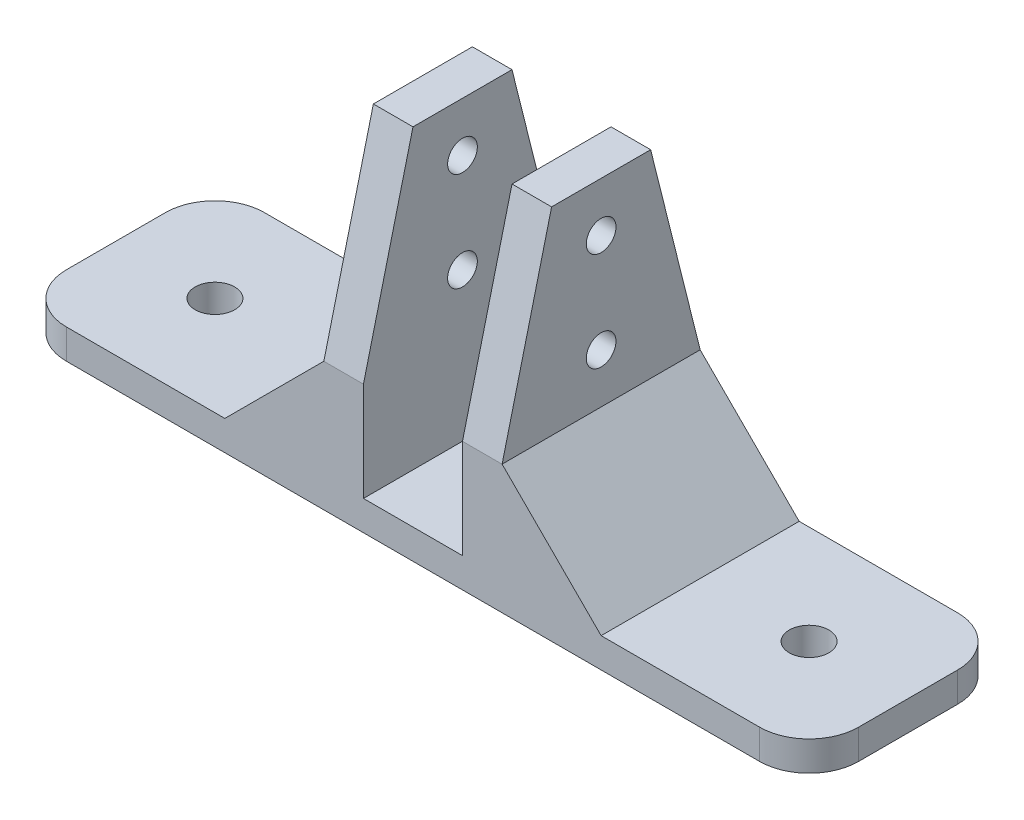
ISO-10303-21;
HEADER;
FILE_DESCRIPTION(('STEP AP214'),'2;1');
FILE_NAME('part.step','',(''),(''),'','','');
FILE_SCHEMA(('AUTOMOTIVE_DESIGN { 1 0 10303 214 1 1 1 1 }'));
ENDSEC;
DATA;
#1=APPLICATION_CONTEXT('core data for automotive mechanical design processes');
#2=APPLICATION_PROTOCOL_DEFINITION('international standard','automotive_design',2000,#1);
#3=PRODUCT_CONTEXT('',#1,'mechanical');
#4=PRODUCT('Part','Part','',(#3));
#5=PRODUCT_RELATED_PRODUCT_CATEGORY('part','',(#4));
#6=PRODUCT_DEFINITION_FORMATION('','',#4);
#7=PRODUCT_DEFINITION_CONTEXT('part definition',#1,'design');
#8=PRODUCT_DEFINITION('design','',#6,#7);
#9=PRODUCT_DEFINITION_SHAPE('','',#8);
#10=(LENGTH_UNIT() NAMED_UNIT(*) SI_UNIT(.MILLI.,.METRE.));
#11=(NAMED_UNIT(*) PLANE_ANGLE_UNIT() SI_UNIT($,.RADIAN.));
#12=(NAMED_UNIT(*) SI_UNIT($,.STERADIAN.) SOLID_ANGLE_UNIT());
#13=UNCERTAINTY_MEASURE_WITH_UNIT(LENGTH_MEASURE(1.E-05),#10,'distance_accuracy_value','');
#14=(GEOMETRIC_REPRESENTATION_CONTEXT(3) GLOBAL_UNCERTAINTY_ASSIGNED_CONTEXT((#13)) GLOBAL_UNIT_ASSIGNED_CONTEXT((#10,
#11,#12)) REPRESENTATION_CONTEXT('',''));
#15=CARTESIAN_POINT('',(0.,0.,0.));
#16=DIRECTION('',(0.,0.,1.));
#17=DIRECTION('',(1.,0.,0.));
#18=AXIS2_PLACEMENT_3D('',#15,#16,#17);
#19=CARTESIAN_POINT('',(0.,3.,0.));
#20=DIRECTION('',(0.,1.,0.));
#21=DIRECTION('',(0.,0.,1.));
#22=AXIS2_PLACEMENT_3D('',#19,#20,#21);
#23=PLANE('',#22);
#24=CARTESIAN_POINT('',(30.,3.,0.));
#25=DIRECTION('',(0.,1.,0.));
#26=DIRECTION('',(0.,0.,1.));
#27=AXIS2_PLACEMENT_3D('',#24,#25,#26);
#28=CIRCLE('',#27,2.);
#29=CARTESIAN_POINT('',(30.,3.,2.));
#30=VERTEX_POINT('',#29);
#31=EDGE_CURVE('E394',#30,#30,#28,.T.);
#32=ORIENTED_EDGE('',*,*,#31,.F.);
#33=EDGE_LOOP('',(#32));
#34=FACE_BOUND('',#33,.T.);
#35=DIRECTION('',(0.,0.,-1.));
#36=VECTOR('',#35,1.);
#37=CARTESIAN_POINT('',(40.,3.,-10.));
#38=LINE('',#37,#36);
#39=CARTESIAN_POINT('',(40.,3.,5.));
#40=VERTEX_POINT('',#39);
#41=CARTESIAN_POINT('',(40.,3.,-5.));
#42=VERTEX_POINT('',#41);
#43=EDGE_CURVE('E282',#40,#42,#38,.T.);
#44=ORIENTED_EDGE('',*,*,#43,.T.);
#45=CARTESIAN_POINT('',(35.,3.,-5.));
#46=DIRECTION('',(0.,1.,0.));
#47=DIRECTION('',(0.,0.,1.));
#48=AXIS2_PLACEMENT_3D('',#45,#46,#47);
#49=CIRCLE('',#48,5.);
#50=CARTESIAN_POINT('',(35.,3.,-10.));
#51=VERTEX_POINT('',#50);
#52=EDGE_CURVE('E257',#42,#51,#49,.T.);
#53=ORIENTED_EDGE('',*,*,#52,.T.);
#54=DIRECTION('',(-1.,0.,0.));
#55=VECTOR('',#54,1.);
#56=CARTESIAN_POINT('',(-40.,3.,-10.));
#57=LINE('',#56,#55);
#58=CARTESIAN_POINT('',(18.9999999999995,3.,-10.));
#59=VERTEX_POINT('',#58);
#60=EDGE_CURVE('E290',#51,#59,#57,.T.);
#61=ORIENTED_EDGE('',*,*,#60,.T.);
#62=DIRECTION('',(0.,0.,1.));
#63=VECTOR('',#62,1.);
#64=CARTESIAN_POINT('',(18.9999999999995,3.,-10.));
#65=LINE('',#64,#63);
#66=CARTESIAN_POINT('',(18.9999999999995,3.,10.));
#67=VERTEX_POINT('',#66);
#68=EDGE_CURVE('E437',#59,#67,#65,.T.);
#69=ORIENTED_EDGE('',*,*,#68,.T.);
#70=DIRECTION('',(1.,0.,0.));
#71=VECTOR('',#70,1.);
#72=CARTESIAN_POINT('',(-40.,3.,10.));
#73=LINE('',#72,#71);
#74=CARTESIAN_POINT('',(35.,3.,10.));
#75=VERTEX_POINT('',#74);
#76=EDGE_CURVE('E236',#67,#75,#73,.T.);
#77=ORIENTED_EDGE('',*,*,#76,.T.);
#78=CARTESIAN_POINT('',(35.,3.,5.));
#79=DIRECTION('',(0.,1.,0.));
#80=DIRECTION('',(0.,0.,1.));
#81=AXIS2_PLACEMENT_3D('',#78,#79,#80);
#82=CIRCLE('',#81,5.);
#83=EDGE_CURVE('E310',#75,#40,#82,.T.);
#84=ORIENTED_EDGE('',*,*,#83,.T.);
#85=EDGE_LOOP('',(#44,#53,#61,#69,#77,#84));
#86=FACE_BOUND('',#85,.T.);
#87=ADVANCED_FACE('F35',(#34,#86),#23,.T.);
#88=CARTESIAN_POINT('',(-5.,3.,10.));
#89=VERTEX_POINT('',#88);
#90=CARTESIAN_POINT('',(5.,3.,10.));
#91=VERTEX_POINT('',#90);
#92=EDGE_CURVE('E240',#89,#91,#73,.T.);
#93=ORIENTED_EDGE('',*,*,#92,.T.);
#94=DIRECTION('',(0.,0.,1.));
#95=VECTOR('',#94,1.);
#96=CARTESIAN_POINT('',(5.,3.,-10.));
#97=LINE('',#96,#95);
#98=CARTESIAN_POINT('',(5.,3.,-10.));
#99=VERTEX_POINT('',#98);
#100=EDGE_CURVE('E439',#99,#91,#97,.T.);
#101=ORIENTED_EDGE('',*,*,#100,.F.);
#102=CARTESIAN_POINT('',(-5.,3.,-10.));
#103=VERTEX_POINT('',#102);
#104=EDGE_CURVE('E242',#99,#103,#57,.T.);
#105=ORIENTED_EDGE('',*,*,#104,.T.);
#106=DIRECTION('',(0.,0.,1.));
#107=VECTOR('',#106,1.);
#108=CARTESIAN_POINT('',(-5.,3.,-10.));
#109=LINE('',#108,#107);
#110=EDGE_CURVE('E200',#103,#89,#109,.T.);
#111=ORIENTED_EDGE('',*,*,#110,.T.);
#112=EDGE_LOOP('',(#93,#101,#105,#111));
#113=FACE_BOUND('',#112,.T.);
#114=ADVANCED_FACE('F366',(#113),#23,.T.);
#115=CARTESIAN_POINT('',(40.,3.,-10.));
#116=DIRECTION('',(-1.,0.,0.));
#117=DIRECTION('',(0.,0.,1.));
#118=AXIS2_PLACEMENT_3D('',#115,#116,#117);
#119=PLANE('',#118);
#120=DIRECTION('',(0.,0.,-1.));
#121=VECTOR('',#120,1.);
#122=CARTESIAN_POINT('',(40.,0.,-10.));
#123=LINE('',#122,#121);
#124=CARTESIAN_POINT('',(40.,0.,5.));
#125=VERTEX_POINT('',#124);
#126=CARTESIAN_POINT('',(40.,0.,-5.));
#127=VERTEX_POINT('',#126);
#128=EDGE_CURVE('E195',#125,#127,#123,.T.);
#129=ORIENTED_EDGE('',*,*,#128,.T.);
#130=DIRECTION('',(0.,-1.,0.));
#131=VECTOR('',#130,1.);
#132=CARTESIAN_POINT('',(40.,3.,-5.));
#133=LINE('',#132,#131);
#134=EDGE_CURVE('E309',#127,#42,#133,.F.);
#135=ORIENTED_EDGE('',*,*,#134,.T.);
#136=ORIENTED_EDGE('',*,*,#43,.F.);
#137=DIRECTION('',(0.,-1.,0.));
#138=VECTOR('',#137,1.);
#139=CARTESIAN_POINT('',(40.,3.,5.));
#140=LINE('',#139,#138);
#141=EDGE_CURVE('E306',#40,#125,#140,.T.);
#142=ORIENTED_EDGE('',*,*,#141,.T.);
#143=EDGE_LOOP('',(#129,#135,#136,#142));
#144=FACE_BOUND('',#143,.T.);
#145=ADVANCED_FACE('F331',(#144),#119,.F.);
#146=CARTESIAN_POINT('',(-40.,3.,-10.));
#147=DIRECTION('',(0.,0.,1.));
#148=DIRECTION('',(1.,0.,0.));
#149=AXIS2_PLACEMENT_3D('',#146,#147,#148);
#150=PLANE('',#149);
#151=ORIENTED_EDGE('',*,*,#60,.F.);
#152=DIRECTION('',(0.,-1.,0.));
#153=VECTOR('',#152,1.);
#154=CARTESIAN_POINT('',(35.,3.,-10.));
#155=LINE('',#154,#153);
#156=CARTESIAN_POINT('',(35.,0.,-10.));
#157=VERTEX_POINT('',#156);
#158=EDGE_CURVE('E297',#51,#157,#155,.T.);
#159=ORIENTED_EDGE('',*,*,#158,.T.);
#160=DIRECTION('',(-1.,0.,0.));
#161=VECTOR('',#160,1.);
#162=CARTESIAN_POINT('',(-40.,0.,-10.));
#163=LINE('',#162,#161);
#164=CARTESIAN_POINT('',(-35.,0.,-10.));
#165=VERTEX_POINT('',#164);
#166=EDGE_CURVE('E198',#157,#165,#163,.T.);
#167=ORIENTED_EDGE('',*,*,#166,.T.);
#168=DIRECTION('',(0.,-1.,0.));
#169=VECTOR('',#168,1.);
#170=CARTESIAN_POINT('',(-35.,3.,-10.));
#171=LINE('',#170,#169);
#172=CARTESIAN_POINT('',(-35.,3.,-10.));
#173=VERTEX_POINT('',#172);
#174=EDGE_CURVE('E295',#165,#173,#171,.F.);
#175=ORIENTED_EDGE('',*,*,#174,.T.);
#176=CARTESIAN_POINT('',(-18.9999999999995,3.,-10.));
#177=VERTEX_POINT('',#176);
#178=EDGE_CURVE('E284',#177,#173,#57,.T.);
#179=ORIENTED_EDGE('',*,*,#178,.F.);
#180=DIRECTION('',(-0.70710678118653,-0.707106781186566,0.));
#181=VECTOR('',#180,1.);
#182=CARTESIAN_POINT('',(-11.0000000000002,10.9999999999997,-10.));
#183=LINE('',#182,#181);
#184=CARTESIAN_POINT('',(-9.,13.,-10.));
#185=VERTEX_POINT('',#184);
#186=EDGE_CURVE('E221',#185,#177,#183,.T.);
#187=ORIENTED_EDGE('',*,*,#186,.F.);
#188=DIRECTION('',(-1.,0.,0.));
#189=VECTOR('',#188,1.);
#190=CARTESIAN_POINT('',(191.,12.9999999999975,-10.));
#191=LINE('',#190,#189);
#192=CARTESIAN_POINT('',(-5.,13.,-10.));
#193=VERTEX_POINT('',#192);
#194=EDGE_CURVE('E177',#193,#185,#191,.T.);
#195=ORIENTED_EDGE('',*,*,#194,.F.);
#196=DIRECTION('',(0.,1.,0.));
#197=VECTOR('',#196,1.);
#198=CARTESIAN_POINT('',(-5.,0.,-10.));
#199=LINE('',#198,#197);
#200=EDGE_CURVE('E217',#103,#193,#199,.T.);
#201=ORIENTED_EDGE('',*,*,#200,.F.);
#202=ORIENTED_EDGE('',*,*,#104,.F.);
#203=DIRECTION('',(0.,1.,0.));
#204=VECTOR('',#203,1.);
#205=CARTESIAN_POINT('',(5.,0.,-10.));
#206=LINE('',#205,#204);
#207=CARTESIAN_POINT('',(5.,12.9999999999998,-10.));
#208=VERTEX_POINT('',#207);
#209=EDGE_CURVE('E426',#99,#208,#206,.T.);
#210=ORIENTED_EDGE('',*,*,#209,.T.);
#211=CARTESIAN_POINT('',(8.99999999999987,12.9999999999998,-10.));
#212=VERTEX_POINT('',#211);
#213=EDGE_CURVE('E493',#212,#208,#191,.T.);
#214=ORIENTED_EDGE('',*,*,#213,.F.);
#215=DIRECTION('',(0.70710678118653,-0.707106781186566,0.));
#216=VECTOR('',#215,1.);
#217=CARTESIAN_POINT('',(11.0000000000002,10.9999999999997,-10.));
#218=LINE('',#217,#216);
#219=EDGE_CURVE('E326',#212,#59,#218,.T.);
#220=ORIENTED_EDGE('',*,*,#219,.T.);
#221=EDGE_LOOP('',(#151,#159,#167,#175,#179,#187,#195,#201,#202,#210,#214,#220));
#222=FACE_BOUND('',#221,.T.);
#223=ADVANCED_FACE('F323',(#222),#150,.F.);
#224=CARTESIAN_POINT('',(-40.,3.,-10.));
#225=DIRECTION('',(1.,0.,0.));
#226=DIRECTION('',(0.,0.,-1.));
#227=AXIS2_PLACEMENT_3D('',#224,#225,#226);
#228=PLANE('',#227);
#229=DIRECTION('',(0.,0.,1.));
#230=VECTOR('',#229,1.);
#231=CARTESIAN_POINT('',(-40.,0.,-10.));
#232=LINE('',#231,#230);
#233=CARTESIAN_POINT('',(-40.,0.,-5.));
#234=VERTEX_POINT('',#233);
#235=CARTESIAN_POINT('',(-40.,0.,5.));
#236=VERTEX_POINT('',#235);
#237=EDGE_CURVE('E270',#234,#236,#232,.T.);
#238=ORIENTED_EDGE('',*,*,#237,.T.);
#239=DIRECTION('',(0.,-1.,0.));
#240=VECTOR('',#239,1.);
#241=CARTESIAN_POINT('',(-40.,3.,5.));
#242=LINE('',#241,#240);
#243=CARTESIAN_POINT('',(-40.,3.,5.));
#244=VERTEX_POINT('',#243);
#245=EDGE_CURVE('E50',#236,#244,#242,.F.);
#246=ORIENTED_EDGE('',*,*,#245,.T.);
#247=DIRECTION('',(0.,0.,1.));
#248=VECTOR('',#247,1.);
#249=CARTESIAN_POINT('',(-40.,3.,-10.));
#250=LINE('',#249,#248);
#251=CARTESIAN_POINT('',(-40.,3.,-5.));
#252=VERTEX_POINT('',#251);
#253=EDGE_CURVE('E241',#252,#244,#250,.T.);
#254=ORIENTED_EDGE('',*,*,#253,.F.);
#255=DIRECTION('',(0.,-1.,0.));
#256=VECTOR('',#255,1.);
#257=CARTESIAN_POINT('',(-40.,3.,-5.));
#258=LINE('',#257,#256);
#259=EDGE_CURVE('E264',#252,#234,#258,.T.);
#260=ORIENTED_EDGE('',*,*,#259,.T.);
#261=EDGE_LOOP('',(#238,#246,#254,#260));
#262=FACE_BOUND('',#261,.T.);
#263=ADVANCED_FACE('F269',(#262),#228,.F.);
#264=CARTESIAN_POINT('',(-40.,3.,10.));
#265=DIRECTION('',(0.,0.,-1.));
#266=DIRECTION('',(-1.,0.,0.));
#267=AXIS2_PLACEMENT_3D('',#264,#265,#266);
#268=PLANE('',#267);
#269=DIRECTION('',(1.,0.,0.));
#270=VECTOR('',#269,1.);
#271=CARTESIAN_POINT('',(-40.,0.,10.));
#272=LINE('',#271,#270);
#273=CARTESIAN_POINT('',(-35.,0.,10.));
#274=VERTEX_POINT('',#273);
#275=CARTESIAN_POINT('',(35.,0.,10.));
#276=VERTEX_POINT('',#275);
#277=EDGE_CURVE('E279',#274,#276,#272,.T.);
#278=ORIENTED_EDGE('',*,*,#277,.T.);
#279=DIRECTION('',(0.,-1.,0.));
#280=VECTOR('',#279,1.);
#281=CARTESIAN_POINT('',(35.,3.,10.));
#282=LINE('',#281,#280);
#283=EDGE_CURVE('E262',#276,#75,#282,.F.);
#284=ORIENTED_EDGE('',*,*,#283,.T.);
#285=ORIENTED_EDGE('',*,*,#76,.F.);
#286=DIRECTION('',(0.70710678118653,-0.707106781186566,0.));
#287=VECTOR('',#286,1.);
#288=CARTESIAN_POINT('',(11.0000000000002,10.9999999999997,10.));
#289=LINE('',#288,#287);
#290=CARTESIAN_POINT('',(8.99999999999987,12.9999999999998,10.));
#291=VERTEX_POINT('',#290);
#292=EDGE_CURVE('E429',#291,#67,#289,.T.);
#293=ORIENTED_EDGE('',*,*,#292,.F.);
#294=DIRECTION('',(-1.,0.,0.));
#295=VECTOR('',#294,1.);
#296=CARTESIAN_POINT('',(191.,12.9999999999975,10.));
#297=LINE('',#296,#295);
#298=CARTESIAN_POINT('',(5.,12.9999999999998,10.));
#299=VERTEX_POINT('',#298);
#300=EDGE_CURVE('E357',#291,#299,#297,.T.);
#301=ORIENTED_EDGE('',*,*,#300,.T.);
#302=DIRECTION('',(0.,1.,0.));
#303=VECTOR('',#302,1.);
#304=CARTESIAN_POINT('',(5.,0.,10.));
#305=LINE('',#304,#303);
#306=EDGE_CURVE('E425',#91,#299,#305,.T.);
#307=ORIENTED_EDGE('',*,*,#306,.F.);
#308=ORIENTED_EDGE('',*,*,#92,.F.);
#309=DIRECTION('',(0.,1.,0.));
#310=VECTOR('',#309,1.);
#311=CARTESIAN_POINT('',(-5.,0.,10.));
#312=LINE('',#311,#310);
#313=CARTESIAN_POINT('',(-5.,12.9999999999975,10.));
#314=VERTEX_POINT('',#313);
#315=EDGE_CURVE('E227',#89,#314,#312,.T.);
#316=ORIENTED_EDGE('',*,*,#315,.T.);
#317=CARTESIAN_POINT('',(-9.,13.,10.));
#318=VERTEX_POINT('',#317);
#319=EDGE_CURVE('E352',#314,#318,#297,.T.);
#320=ORIENTED_EDGE('',*,*,#319,.T.);
#321=DIRECTION('',(-0.70710678118653,-0.707106781186566,0.));
#322=VECTOR('',#321,1.);
#323=CARTESIAN_POINT('',(-11.0000000000002,10.9999999999997,10.));
#324=LINE('',#323,#322);
#325=CARTESIAN_POINT('',(-18.9999999999995,3.,10.));
#326=VERTEX_POINT('',#325);
#327=EDGE_CURVE('E230',#318,#326,#324,.T.);
#328=ORIENTED_EDGE('',*,*,#327,.T.);
#329=CARTESIAN_POINT('',(-35.,3.,10.));
#330=VERTEX_POINT('',#329);
#331=EDGE_CURVE('E253',#330,#326,#73,.T.);
#332=ORIENTED_EDGE('',*,*,#331,.F.);
#333=DIRECTION('',(0.,-1.,0.));
#334=VECTOR('',#333,1.);
#335=CARTESIAN_POINT('',(-35.,3.,10.));
#336=LINE('',#335,#334);
#337=EDGE_CURVE('E259',#330,#274,#336,.T.);
#338=ORIENTED_EDGE('',*,*,#337,.T.);
#339=EDGE_LOOP('',(#278,#284,#285,#293,#301,#307,#308,#316,#320,#328,#332,#338));
#340=FACE_BOUND('',#339,.T.);
#341=ADVANCED_FACE('F337',(#340),#268,.F.);
#342=CARTESIAN_POINT('',(-30.,3.,0.));
#343=DIRECTION('',(0.,1.,0.));
#344=DIRECTION('',(0.,0.,1.));
#345=AXIS2_PLACEMENT_3D('',#342,#343,#344);
#346=CIRCLE('',#345,2.);
#347=CARTESIAN_POINT('',(-30.,3.,2.));
#348=VERTEX_POINT('',#347);
#349=EDGE_CURVE('E388',#348,#348,#346,.T.);
#350=ORIENTED_EDGE('',*,*,#349,.F.);
#351=EDGE_LOOP('',(#350));
#352=FACE_BOUND('',#351,.T.);
#353=ORIENTED_EDGE('',*,*,#253,.T.);
#354=CARTESIAN_POINT('',(-35.,3.,5.));
#355=DIRECTION('',(0.,1.,0.));
#356=DIRECTION('',(0.,0.,1.));
#357=AXIS2_PLACEMENT_3D('',#354,#355,#356);
#358=CIRCLE('',#357,5.);
#359=EDGE_CURVE('E11',#244,#330,#358,.T.);
#360=ORIENTED_EDGE('',*,*,#359,.T.);
#361=ORIENTED_EDGE('',*,*,#331,.T.);
#362=DIRECTION('',(0.,0.,1.));
#363=VECTOR('',#362,1.);
#364=CARTESIAN_POINT('',(-18.9999999999995,3.,-10.));
#365=LINE('',#364,#363);
#366=EDGE_CURVE('E214',#177,#326,#365,.T.);
#367=ORIENTED_EDGE('',*,*,#366,.F.);
#368=ORIENTED_EDGE('',*,*,#178,.T.);
#369=CARTESIAN_POINT('',(-35.,3.,-5.));
#370=DIRECTION('',(0.,1.,0.));
#371=DIRECTION('',(0.,0.,1.));
#372=AXIS2_PLACEMENT_3D('',#369,#370,#371);
#373=CIRCLE('',#372,5.);
#374=EDGE_CURVE('E43',#173,#252,#373,.T.);
#375=ORIENTED_EDGE('',*,*,#374,.T.);
#376=EDGE_LOOP('',(#353,#360,#361,#367,#368,#375));
#377=FACE_BOUND('',#376,.T.);
#378=ADVANCED_FACE('F343',(#352,#377),#23,.T.);
#379=CARTESIAN_POINT('',(0.,0.,0.));
#380=DIRECTION('',(0.,1.,0.));
#381=DIRECTION('',(0.,0.,1.));
#382=AXIS2_PLACEMENT_3D('',#379,#380,#381);
#383=PLANE('',#382);
#384=CARTESIAN_POINT('',(-30.,0.,0.));
#385=DIRECTION('',(0.,1.,0.));
#386=DIRECTION('',(0.,0.,1.));
#387=AXIS2_PLACEMENT_3D('',#384,#385,#386);
#388=CIRCLE('',#387,2.);
#389=CARTESIAN_POINT('',(-30.,0.,2.));
#390=VERTEX_POINT('',#389);
#391=EDGE_CURVE('E390',#390,#390,#388,.T.);
#392=ORIENTED_EDGE('',*,*,#391,.T.);
#393=EDGE_LOOP('',(#392));
#394=FACE_BOUND('',#393,.T.);
#395=CARTESIAN_POINT('',(30.,0.,0.));
#396=DIRECTION('',(0.,1.,0.));
#397=DIRECTION('',(0.,0.,1.));
#398=AXIS2_PLACEMENT_3D('',#395,#396,#397);
#399=CIRCLE('',#398,2.);
#400=CARTESIAN_POINT('',(30.,0.,2.));
#401=VERTEX_POINT('',#400);
#402=EDGE_CURVE('E402',#401,#401,#399,.T.);
#403=ORIENTED_EDGE('',*,*,#402,.T.);
#404=EDGE_LOOP('',(#403));
#405=FACE_BOUND('',#404,.T.);
#406=ORIENTED_EDGE('',*,*,#166,.F.);
#407=CARTESIAN_POINT('',(35.,0.,-5.));
#408=DIRECTION('',(0.,1.,0.));
#409=DIRECTION('',(0.,0.,1.));
#410=AXIS2_PLACEMENT_3D('',#407,#408,#409);
#411=CIRCLE('',#410,5.);
#412=EDGE_CURVE('E304',#157,#127,#411,.F.);
#413=ORIENTED_EDGE('',*,*,#412,.T.);
#414=ORIENTED_EDGE('',*,*,#128,.F.);
#415=CARTESIAN_POINT('',(35.,0.,5.));
#416=DIRECTION('',(0.,1.,0.));
#417=DIRECTION('',(0.,0.,1.));
#418=AXIS2_PLACEMENT_3D('',#415,#416,#417);
#419=CIRCLE('',#418,5.);
#420=EDGE_CURVE('E302',#125,#276,#419,.F.);
#421=ORIENTED_EDGE('',*,*,#420,.T.);
#422=ORIENTED_EDGE('',*,*,#277,.F.);
#423=CARTESIAN_POINT('',(-35.,0.,5.));
#424=DIRECTION('',(0.,1.,0.));
#425=DIRECTION('',(0.,0.,1.));
#426=AXIS2_PLACEMENT_3D('',#423,#424,#425);
#427=CIRCLE('',#426,5.);
#428=EDGE_CURVE('E278',#274,#236,#427,.F.);
#429=ORIENTED_EDGE('',*,*,#428,.T.);
#430=ORIENTED_EDGE('',*,*,#237,.F.);
#431=CARTESIAN_POINT('',(-35.,0.,-5.));
#432=DIRECTION('',(0.,1.,0.));
#433=DIRECTION('',(0.,0.,1.));
#434=AXIS2_PLACEMENT_3D('',#431,#432,#433);
#435=CIRCLE('',#434,5.);
#436=EDGE_CURVE('E275',#234,#165,#435,.F.);
#437=ORIENTED_EDGE('',*,*,#436,.T.);
#438=EDGE_LOOP('',(#406,#413,#414,#421,#422,#429,#430,#437));
#439=FACE_BOUND('',#438,.T.);
#440=ADVANCED_FACE('F274',(#394,#405,#439),#383,.F.);
#441=CARTESIAN_POINT('',(-9.00000000000016,1.13971332371681E-13,-10.));
#442=DIRECTION('',(-1.,0.,0.));
#443=DIRECTION('',(0.,-1.,0.));
#444=AXIS2_PLACEMENT_3D('',#441,#442,#443);
#445=PLANE('',#444);
#446=DIRECTION('',(0.,0.97014250014533,0.242535625036339));
#447=VECTOR('',#446,1.);
#448=CARTESIAN_POINT('',(-8.99999999999974,32.9999999999995,-5.));
#449=LINE('',#448,#447);
#450=CARTESIAN_POINT('',(-8.99999999999974,32.9999999999995,-5.));
#451=VERTEX_POINT('',#450);
#452=EDGE_CURVE('E171',#185,#451,#449,.T.);
#453=ORIENTED_EDGE('',*,*,#452,.F.);
#454=DIRECTION('',(0.,0.,1.));
#455=VECTOR('',#454,1.);
#456=CARTESIAN_POINT('',(-9.,13.,-10.));
#457=LINE('',#456,#455);
#458=EDGE_CURVE('E220',#185,#318,#457,.T.);
#459=ORIENTED_EDGE('',*,*,#458,.T.);
#460=DIRECTION('',(0.,-0.97014250014533,0.242535625036339));
#461=VECTOR('',#460,1.);
#462=CARTESIAN_POINT('',(-8.99999999999974,32.9999999999995,5.));
#463=LINE('',#462,#461);
#464=CARTESIAN_POINT('',(-8.99999999999974,32.9999999999995,5.));
#465=VERTEX_POINT('',#464);
#466=EDGE_CURVE('E194',#465,#318,#463,.T.);
#467=ORIENTED_EDGE('',*,*,#466,.F.);
#468=DIRECTION('',(0.,0.,1.));
#469=VECTOR('',#468,1.);
#470=CARTESIAN_POINT('',(-8.99999999999974,32.9999999999995,-10.));
#471=LINE('',#470,#469);
#472=EDGE_CURVE('E187',#451,#465,#471,.T.);
#473=ORIENTED_EDGE('',*,*,#472,.F.);
#474=EDGE_LOOP('',(#453,#459,#467,#473));
#475=FACE_BOUND('',#474,.T.);
#476=CARTESIAN_POINT('',(-8.99999999999981,27.9999999999995,0.));
#477=DIRECTION('',(-1.,0.,0.));
#478=DIRECTION('',(0.,0.,1.));
#479=AXIS2_PLACEMENT_3D('',#476,#477,#478);
#480=CIRCLE('',#479,1.49999999999999);
#481=CARTESIAN_POINT('',(-8.99999999999981,27.9999999999995,1.49999999999999));
#482=VERTEX_POINT('',#481);
#483=EDGE_CURVE('E405',#482,#482,#480,.T.);
#484=ORIENTED_EDGE('',*,*,#483,.F.);
#485=EDGE_LOOP('',(#484));
#486=FACE_BOUND('',#485,.T.);
#487=CARTESIAN_POINT('',(-8.99999999999993,18.,0.));
#488=DIRECTION('',(-1.,0.,0.));
#489=DIRECTION('',(0.,0.,1.));
#490=AXIS2_PLACEMENT_3D('',#487,#488,#489);
#491=CIRCLE('',#490,1.49999999999999);
#492=CARTESIAN_POINT('',(-8.99999999999993,18.,1.49999999999999));
#493=VERTEX_POINT('',#492);
#494=EDGE_CURVE('E415',#493,#493,#491,.T.);
#495=ORIENTED_EDGE('',*,*,#494,.F.);
#496=EDGE_LOOP('',(#495));
#497=FACE_BOUND('',#496,.T.);
#498=ADVANCED_FACE('F192',(#475,#486,#497),#445,.T.);
#499=CARTESIAN_POINT('',(0.,32.9999999999995,-10.));
#500=DIRECTION('',(0.,1.,0.));
#501=DIRECTION('',(0.,0.,1.));
#502=AXIS2_PLACEMENT_3D('',#499,#500,#501);
#503=PLANE('',#502);
#504=DIRECTION('',(-1.,0.,0.));
#505=VECTOR('',#504,1.);
#506=CARTESIAN_POINT('',(191.,32.999999999997,-5.));
#507=LINE('',#506,#505);
#508=CARTESIAN_POINT('',(-5.,32.9999999999995,-5.));
#509=VERTEX_POINT('',#508);
#510=EDGE_CURVE('E174',#509,#451,#507,.T.);
#511=ORIENTED_EDGE('',*,*,#510,.T.);
#512=ORIENTED_EDGE('',*,*,#472,.T.);
#513=DIRECTION('',(-1.,0.,0.));
#514=VECTOR('',#513,1.);
#515=CARTESIAN_POINT('',(191.,32.999999999997,5.));
#516=LINE('',#515,#514);
#517=CARTESIAN_POINT('',(-5.,32.9999999999994,5.));
#518=VERTEX_POINT('',#517);
#519=EDGE_CURVE('E485',#518,#465,#516,.T.);
#520=ORIENTED_EDGE('',*,*,#519,.F.);
#521=DIRECTION('',(0.,0.,1.));
#522=VECTOR('',#521,1.);
#523=CARTESIAN_POINT('',(-5.,32.9999999999995,-10.));
#524=LINE('',#523,#522);
#525=EDGE_CURVE('E189',#509,#518,#524,.T.);
#526=ORIENTED_EDGE('',*,*,#525,.F.);
#527=EDGE_LOOP('',(#511,#512,#520,#526));
#528=FACE_BOUND('',#527,.T.);
#529=ADVANCED_FACE('F185',(#528),#503,.T.);
#530=CARTESIAN_POINT('',(-5.,0.,-10.));
#531=DIRECTION('',(1.,0.,0.));
#532=DIRECTION('',(0.,0.,-1.));
#533=AXIS2_PLACEMENT_3D('',#530,#531,#532);
#534=PLANE('',#533);
#535=DIRECTION('',(0.,-0.970142500145331,-0.242535625036339));
#536=VECTOR('',#535,1.);
#537=CARTESIAN_POINT('',(-5.,0.764705882352975,-13.0588235294118));
#538=LINE('',#537,#536);
#539=EDGE_CURVE('E490',#509,#193,#538,.T.);
#540=ORIENTED_EDGE('',*,*,#539,.F.);
#541=ORIENTED_EDGE('',*,*,#525,.T.);
#542=DIRECTION('',(0.,0.970142500145331,-0.242535625036339));
#543=VECTOR('',#542,1.);
#544=CARTESIAN_POINT('',(-5.,5.47058823529426,11.8823529411765));
#545=LINE('',#544,#543);
#546=EDGE_CURVE('E391',#314,#518,#545,.T.);
#547=ORIENTED_EDGE('',*,*,#546,.F.);
#548=ORIENTED_EDGE('',*,*,#315,.F.);
#549=ORIENTED_EDGE('',*,*,#110,.F.);
#550=ORIENTED_EDGE('',*,*,#200,.T.);
#551=EDGE_LOOP('',(#540,#541,#547,#548,#549,#550));
#552=FACE_BOUND('',#551,.T.);
#553=CARTESIAN_POINT('',(-5.,27.9999999999995,0.));
#554=DIRECTION('',(1.,0.,0.));
#555=DIRECTION('',(0.,0.,-1.));
#556=AXIS2_PLACEMENT_3D('',#553,#554,#555);
#557=CIRCLE('',#556,1.49999999999999);
#558=CARTESIAN_POINT('',(-5.,27.9999999999995,-1.49999999999999));
#559=VERTEX_POINT('',#558);
#560=EDGE_CURVE('E408',#559,#559,#557,.T.);
#561=ORIENTED_EDGE('',*,*,#560,.F.);
#562=EDGE_LOOP('',(#561));
#563=FACE_BOUND('',#562,.T.);
#564=CARTESIAN_POINT('',(-5.,18.,0.));
#565=DIRECTION('',(1.,0.,0.));
#566=DIRECTION('',(0.,0.,-1.));
#567=AXIS2_PLACEMENT_3D('',#564,#565,#566);
#568=CIRCLE('',#567,1.49999999999999);
#569=CARTESIAN_POINT('',(-5.,18.,-1.49999999999999));
#570=VERTEX_POINT('',#569);
#571=EDGE_CURVE('E422',#570,#570,#568,.T.);
#572=ORIENTED_EDGE('',*,*,#571,.F.);
#573=EDGE_LOOP('',(#572));
#574=FACE_BOUND('',#573,.T.);
#575=ADVANCED_FACE('F501',(#552,#563,#574),#534,.T.);
#576=CARTESIAN_POINT('',(-11.0000000000002,10.9999999999997,-10.));
#577=DIRECTION('',(-0.707106781186566,0.70710678118653,0.));
#578=DIRECTION('',(-0.70710678118653,-0.707106781186566,0.));
#579=AXIS2_PLACEMENT_3D('',#576,#577,#578);
#580=PLANE('',#579);
#581=ORIENTED_EDGE('',*,*,#327,.F.);
#582=ORIENTED_EDGE('',*,*,#458,.F.);
#583=ORIENTED_EDGE('',*,*,#186,.T.);
#584=ORIENTED_EDGE('',*,*,#366,.T.);
#585=EDGE_LOOP('',(#581,#582,#583,#584));
#586=FACE_BOUND('',#585,.T.);
#587=ADVANCED_FACE('F348',(#586),#580,.T.);
#588=CARTESIAN_POINT('',(9.00000000000016,1.13971332371681E-13,-10.));
#589=DIRECTION('',(-1.,0.,0.));
#590=DIRECTION('',(0.,-1.,0.));
#591=AXIS2_PLACEMENT_3D('',#588,#589,#590);
#592=PLANE('',#591);
#593=CARTESIAN_POINT('',(8.99999999999981,27.9999999999995,0.));
#594=DIRECTION('',(-1.,0.,0.));
#595=DIRECTION('',(0.,-1.,0.));
#596=AXIS2_PLACEMENT_3D('',#593,#594,#595);
#597=CIRCLE('',#596,1.49999999999999);
#598=CARTESIAN_POINT('',(8.99999999999983,26.4999999999995,0.));
#599=VERTEX_POINT('',#598);
#600=EDGE_CURVE('E412',#599,#599,#597,.T.);
#601=ORIENTED_EDGE('',*,*,#600,.T.);
#602=EDGE_LOOP('',(#601));
#603=FACE_BOUND('',#602,.T.);
#604=CARTESIAN_POINT('',(8.99999999999993,18.,0.));
#605=DIRECTION('',(-1.,0.,0.));
#606=DIRECTION('',(0.,-1.,0.));
#607=AXIS2_PLACEMENT_3D('',#604,#605,#606);
#608=CIRCLE('',#607,1.49999999999999);
#609=CARTESIAN_POINT('',(8.99999999999995,16.5,0.));
#610=VERTEX_POINT('',#609);
#611=EDGE_CURVE('E418',#610,#610,#608,.T.);
#612=ORIENTED_EDGE('',*,*,#611,.T.);
#613=EDGE_LOOP('',(#612));
#614=FACE_BOUND('',#613,.T.);
#615=DIRECTION('',(0.,0.,1.));
#616=VECTOR('',#615,1.);
#617=CARTESIAN_POINT('',(9.,13.,-10.));
#618=LINE('',#617,#616);
#619=EDGE_CURVE('E233',#212,#291,#618,.T.);
#620=ORIENTED_EDGE('',*,*,#619,.F.);
#621=DIRECTION('',(0.,0.970142500145331,0.242535625036339));
#622=VECTOR('',#621,1.);
#623=CARTESIAN_POINT('',(9.00000000000015,0.764705882353072,-13.0588235294118));
#624=LINE('',#623,#622);
#625=CARTESIAN_POINT('',(8.99999999999973,32.9999999999993,-5.));
#626=VERTEX_POINT('',#625);
#627=EDGE_CURVE('E455',#212,#626,#624,.T.);
#628=ORIENTED_EDGE('',*,*,#627,.T.);
#629=DIRECTION('',(0.,0.,1.));
#630=VECTOR('',#629,1.);
#631=CARTESIAN_POINT('',(8.99999999999974,32.9999999999995,-10.));
#632=LINE('',#631,#630);
#633=CARTESIAN_POINT('',(8.99999999999974,32.9999999999995,4.99999999999995));
#634=VERTEX_POINT('',#633);
#635=EDGE_CURVE('E203',#626,#634,#632,.T.);
#636=ORIENTED_EDGE('',*,*,#635,.T.);
#637=DIRECTION('',(0.,-0.970142500145331,0.242535625036339));
#638=VECTOR('',#637,1.);
#639=CARTESIAN_POINT('',(9.00000000000009,5.47058823529435,11.8823529411764));
#640=LINE('',#639,#638);
#641=EDGE_CURVE('E396',#634,#291,#640,.T.);
#642=ORIENTED_EDGE('',*,*,#641,.T.);
#643=EDGE_LOOP('',(#620,#628,#636,#642));
#644=FACE_BOUND('',#643,.T.);
#645=ADVANCED_FACE('F453',(#603,#614,#644),#592,.F.);
#646=CARTESIAN_POINT('',(11.0000000000002,10.9999999999997,-10.));
#647=DIRECTION('',(-0.707106781186566,-0.70710678118653,0.));
#648=DIRECTION('',(0.70710678118653,-0.707106781186566,0.));
#649=AXIS2_PLACEMENT_3D('',#646,#647,#648);
#650=PLANE('',#649);
#651=ORIENTED_EDGE('',*,*,#292,.T.);
#652=ORIENTED_EDGE('',*,*,#68,.F.);
#653=ORIENTED_EDGE('',*,*,#219,.F.);
#654=ORIENTED_EDGE('',*,*,#619,.T.);
#655=EDGE_LOOP('',(#651,#652,#653,#654));
#656=FACE_BOUND('',#655,.T.);
#657=ADVANCED_FACE('F478',(#656),#650,.F.);
#658=CARTESIAN_POINT('',(5.,0.,-10.));
#659=DIRECTION('',(1.,0.,0.));
#660=DIRECTION('',(0.,0.,-1.));
#661=AXIS2_PLACEMENT_3D('',#658,#659,#660);
#662=PLANE('',#661);
#663=CARTESIAN_POINT('',(5.,27.9999999999995,0.));
#664=DIRECTION('',(1.,0.,0.));
#665=DIRECTION('',(0.,0.,-1.));
#666=AXIS2_PLACEMENT_3D('',#663,#664,#665);
#667=CIRCLE('',#666,1.49999999999999);
#668=CARTESIAN_POINT('',(5.,27.9999999999995,-1.49999999999999));
#669=VERTEX_POINT('',#668);
#670=EDGE_CURVE('E409',#669,#669,#667,.T.);
#671=ORIENTED_EDGE('',*,*,#670,.T.);
#672=EDGE_LOOP('',(#671));
#673=FACE_BOUND('',#672,.T.);
#674=CARTESIAN_POINT('',(5.,18.,0.));
#675=DIRECTION('',(1.,0.,0.));
#676=DIRECTION('',(0.,0.,-1.));
#677=AXIS2_PLACEMENT_3D('',#674,#675,#676);
#678=CIRCLE('',#677,1.49999999999999);
#679=CARTESIAN_POINT('',(5.,18.,-1.49999999999999));
#680=VERTEX_POINT('',#679);
#681=EDGE_CURVE('E419',#680,#680,#678,.T.);
#682=ORIENTED_EDGE('',*,*,#681,.T.);
#683=EDGE_LOOP('',(#682));
#684=FACE_BOUND('',#683,.T.);
#685=DIRECTION('',(0.,0.,1.));
#686=VECTOR('',#685,1.);
#687=CARTESIAN_POINT('',(5.,32.9999999999995,-10.));
#688=LINE('',#687,#686);
#689=CARTESIAN_POINT('',(5.,32.9999999999995,-4.99999999999995));
#690=VERTEX_POINT('',#689);
#691=CARTESIAN_POINT('',(5.,32.9999999999993,5.));
#692=VERTEX_POINT('',#691);
#693=EDGE_CURVE('E441',#690,#692,#688,.T.);
#694=ORIENTED_EDGE('',*,*,#693,.F.);
#695=DIRECTION('',(0.,-0.970142500145331,-0.242535625036339));
#696=VECTOR('',#695,1.);
#697=CARTESIAN_POINT('',(5.,0.764705882352967,-13.0588235294118));
#698=LINE('',#697,#696);
#699=EDGE_CURVE('E483',#690,#208,#698,.T.);
#700=ORIENTED_EDGE('',*,*,#699,.T.);
#701=ORIENTED_EDGE('',*,*,#209,.F.);
#702=ORIENTED_EDGE('',*,*,#100,.T.);
#703=ORIENTED_EDGE('',*,*,#306,.T.);
#704=DIRECTION('',(0.,0.970142500145331,-0.242535625036339));
#705=VECTOR('',#704,1.);
#706=CARTESIAN_POINT('',(5.,5.47058823529425,11.8823529411764));
#707=LINE('',#706,#705);
#708=EDGE_CURVE('E460',#299,#692,#707,.T.);
#709=ORIENTED_EDGE('',*,*,#708,.T.);
#710=EDGE_LOOP('',(#694,#700,#701,#702,#703,#709));
#711=FACE_BOUND('',#710,.T.);
#712=ADVANCED_FACE('F475',(#673,#684,#711),#662,.F.);
#713=CARTESIAN_POINT('',(0.,32.9999999999995,-10.));
#714=DIRECTION('',(0.,-1.,0.));
#715=DIRECTION('',(0.,0.,-1.));
#716=AXIS2_PLACEMENT_3D('',#713,#714,#715);
#717=PLANE('',#716);
#718=ORIENTED_EDGE('',*,*,#635,.F.);
#719=DIRECTION('',(-1.,0.,0.));
#720=VECTOR('',#719,1.);
#721=CARTESIAN_POINT('',(0.,32.9999999999995,-4.99999999999997));
#722=LINE('',#721,#720);
#723=EDGE_CURVE('E293',#626,#690,#722,.T.);
#724=ORIENTED_EDGE('',*,*,#723,.T.);
#725=ORIENTED_EDGE('',*,*,#693,.T.);
#726=DIRECTION('',(1.,0.,0.));
#727=VECTOR('',#726,1.);
#728=CARTESIAN_POINT('',(0.,32.9999999999995,4.99999999999997));
#729=LINE('',#728,#727);
#730=EDGE_CURVE('E256',#692,#634,#729,.T.);
#731=ORIENTED_EDGE('',*,*,#730,.T.);
#732=EDGE_LOOP('',(#718,#724,#725,#731));
#733=FACE_BOUND('',#732,.T.);
#734=ADVANCED_FACE('F461',(#733),#717,.F.);
#735=CARTESIAN_POINT('',(-8.99999999999993,18.,0.));
#736=DIRECTION('',(-1.,0.,0.));
#737=DIRECTION('',(0.,0.,1.));
#738=AXIS2_PLACEMENT_3D('',#735,#736,#737);
#739=CYLINDRICAL_SURFACE('',#738,1.49999999999999);
#740=ORIENTED_EDGE('',*,*,#611,.F.);
#741=EDGE_LOOP('',(#740));
#742=FACE_BOUND('',#741,.T.);
#743=ORIENTED_EDGE('',*,*,#681,.F.);
#744=EDGE_LOOP('',(#743));
#745=FACE_BOUND('',#744,.T.);
#746=ADVANCED_FACE('F468',(#742,#745),#739,.F.);
#747=ORIENTED_EDGE('',*,*,#571,.T.);
#748=EDGE_LOOP('',(#747));
#749=FACE_BOUND('',#748,.T.);
#750=ORIENTED_EDGE('',*,*,#494,.T.);
#751=EDGE_LOOP('',(#750));
#752=FACE_BOUND('',#751,.T.);
#753=ADVANCED_FACE('F471',(#749,#752),#739,.F.);
#754=CARTESIAN_POINT('',(-8.99999999999981,27.9999999999995,0.));
#755=DIRECTION('',(-1.,0.,0.));
#756=DIRECTION('',(0.,0.,1.));
#757=AXIS2_PLACEMENT_3D('',#754,#755,#756);
#758=CYLINDRICAL_SURFACE('',#757,1.49999999999999);
#759=ORIENTED_EDGE('',*,*,#560,.T.);
#760=EDGE_LOOP('',(#759));
#761=FACE_BOUND('',#760,.T.);
#762=ORIENTED_EDGE('',*,*,#483,.T.);
#763=EDGE_LOOP('',(#762));
#764=FACE_BOUND('',#763,.T.);
#765=ADVANCED_FACE('F521',(#761,#764),#758,.F.);
#766=ORIENTED_EDGE('',*,*,#670,.F.);
#767=EDGE_LOOP('',(#766));
#768=FACE_BOUND('',#767,.T.);
#769=ORIENTED_EDGE('',*,*,#600,.F.);
#770=EDGE_LOOP('',(#769));
#771=FACE_BOUND('',#770,.T.);
#772=ADVANCED_FACE('F519',(#768,#771),#758,.F.);
#773=CARTESIAN_POINT('',(30.,3.,0.));
#774=DIRECTION('',(0.,1.,0.));
#775=DIRECTION('',(0.,0.,1.));
#776=AXIS2_PLACEMENT_3D('',#773,#774,#775);
#777=CYLINDRICAL_SURFACE('',#776,2.);
#778=ORIENTED_EDGE('',*,*,#402,.F.);
#779=EDGE_LOOP('',(#778));
#780=FACE_BOUND('',#779,.T.);
#781=ORIENTED_EDGE('',*,*,#31,.T.);
#782=EDGE_LOOP('',(#781));
#783=FACE_BOUND('',#782,.T.);
#784=ADVANCED_FACE('F515',(#780,#783),#777,.F.);
#785=CARTESIAN_POINT('',(-30.,3.,0.));
#786=DIRECTION('',(0.,1.,0.));
#787=DIRECTION('',(0.,0.,1.));
#788=AXIS2_PLACEMENT_3D('',#785,#786,#787);
#789=CYLINDRICAL_SURFACE('',#788,2.);
#790=ORIENTED_EDGE('',*,*,#391,.F.);
#791=EDGE_LOOP('',(#790));
#792=FACE_BOUND('',#791,.T.);
#793=ORIENTED_EDGE('',*,*,#349,.T.);
#794=EDGE_LOOP('',(#793));
#795=FACE_BOUND('',#794,.T.);
#796=ADVANCED_FACE('F511',(#792,#795),#789,.F.);
#797=CARTESIAN_POINT('',(191.,32.999999999997,5.));
#798=DIRECTION('',(0.,-0.242535625036339,-0.97014250014533));
#799=DIRECTION('',(0.,0.970142500145331,-0.242535625036339));
#800=AXIS2_PLACEMENT_3D('',#797,#798,#799);
#801=PLANE('',#800);
#802=ORIENTED_EDGE('',*,*,#730,.F.);
#803=ORIENTED_EDGE('',*,*,#708,.F.);
#804=ORIENTED_EDGE('',*,*,#300,.F.);
#805=ORIENTED_EDGE('',*,*,#641,.F.);
#806=EDGE_LOOP('',(#802,#803,#804,#805));
#807=FACE_BOUND('',#806,.T.);
#808=ADVANCED_FACE('F457',(#807),#801,.F.);
#809=ORIENTED_EDGE('',*,*,#546,.T.);
#810=ORIENTED_EDGE('',*,*,#519,.T.);
#811=ORIENTED_EDGE('',*,*,#466,.T.);
#812=ORIENTED_EDGE('',*,*,#319,.F.);
#813=EDGE_LOOP('',(#809,#810,#811,#812));
#814=FACE_BOUND('',#813,.T.);
#815=ADVANCED_FACE('F503',(#814),#801,.F.);
#816=CARTESIAN_POINT('',(191.,32.999999999997,-5.));
#817=DIRECTION('',(0.,-0.242535625036339,0.97014250014533));
#818=DIRECTION('',(0.,-0.970142500145331,-0.242535625036339));
#819=AXIS2_PLACEMENT_3D('',#816,#817,#818);
#820=PLANE('',#819);
#821=ORIENTED_EDGE('',*,*,#213,.T.);
#822=ORIENTED_EDGE('',*,*,#699,.F.);
#823=ORIENTED_EDGE('',*,*,#723,.F.);
#824=ORIENTED_EDGE('',*,*,#627,.F.);
#825=EDGE_LOOP('',(#821,#822,#823,#824));
#826=FACE_BOUND('',#825,.T.);
#827=ADVANCED_FACE('F496',(#826),#820,.F.);
#828=ORIENTED_EDGE('',*,*,#539,.T.);
#829=ORIENTED_EDGE('',*,*,#194,.T.);
#830=ORIENTED_EDGE('',*,*,#452,.T.);
#831=ORIENTED_EDGE('',*,*,#510,.F.);
#832=EDGE_LOOP('',(#828,#829,#830,#831));
#833=FACE_BOUND('',#832,.T.);
#834=ADVANCED_FACE('F173',(#833),#820,.F.);
#835=CARTESIAN_POINT('',(35.,3.,-5.));
#836=DIRECTION('',(0.,-1.,0.));
#837=DIRECTION('',(0.,0.,-1.));
#838=AXIS2_PLACEMENT_3D('',#835,#836,#837);
#839=CYLINDRICAL_SURFACE('',#838,5.);
#840=ORIENTED_EDGE('',*,*,#52,.F.);
#841=ORIENTED_EDGE('',*,*,#134,.F.);
#842=ORIENTED_EDGE('',*,*,#412,.F.);
#843=ORIENTED_EDGE('',*,*,#158,.F.);
#844=EDGE_LOOP('',(#840,#841,#842,#843));
#845=FACE_BOUND('',#844,.T.);
#846=ADVANCED_FACE('F328',(#845),#839,.T.);
#847=CARTESIAN_POINT('',(35.,3.,5.));
#848=DIRECTION('',(0.,-1.,0.));
#849=DIRECTION('',(0.,0.,-1.));
#850=AXIS2_PLACEMENT_3D('',#847,#848,#849);
#851=CYLINDRICAL_SURFACE('',#850,5.);
#852=ORIENTED_EDGE('',*,*,#83,.F.);
#853=ORIENTED_EDGE('',*,*,#283,.F.);
#854=ORIENTED_EDGE('',*,*,#420,.F.);
#855=ORIENTED_EDGE('',*,*,#141,.F.);
#856=EDGE_LOOP('',(#852,#853,#854,#855));
#857=FACE_BOUND('',#856,.T.);
#858=ADVANCED_FACE('F334',(#857),#851,.T.);
#859=CARTESIAN_POINT('',(-35.,3.,5.));
#860=DIRECTION('',(0.,-1.,0.));
#861=DIRECTION('',(0.,0.,-1.));
#862=AXIS2_PLACEMENT_3D('',#859,#860,#861);
#863=CYLINDRICAL_SURFACE('',#862,5.);
#864=ORIENTED_EDGE('',*,*,#359,.F.);
#865=ORIENTED_EDGE('',*,*,#245,.F.);
#866=ORIENTED_EDGE('',*,*,#428,.F.);
#867=ORIENTED_EDGE('',*,*,#337,.F.);
#868=EDGE_LOOP('',(#864,#865,#866,#867));
#869=FACE_BOUND('',#868,.T.);
#870=ADVANCED_FACE('F342',(#869),#863,.T.);
#871=CARTESIAN_POINT('',(-35.,3.,-5.));
#872=DIRECTION('',(0.,-1.,0.));
#873=DIRECTION('',(0.,0.,-1.));
#874=AXIS2_PLACEMENT_3D('',#871,#872,#873);
#875=CYLINDRICAL_SURFACE('',#874,5.);
#876=ORIENTED_EDGE('',*,*,#374,.F.);
#877=ORIENTED_EDGE('',*,*,#174,.F.);
#878=ORIENTED_EDGE('',*,*,#436,.F.);
#879=ORIENTED_EDGE('',*,*,#259,.F.);
#880=EDGE_LOOP('',(#876,#877,#878,#879));
#881=FACE_BOUND('',#880,.T.);
#882=ADVANCED_FACE('F37',(#881),#875,.T.);
#883=CLOSED_SHELL('',(#87,#114,#145,#223,#263,#341,#378,#440,#498,#529,#575,#587,#645,#657,#712,
#734,#746,#753,#765,#772,#784,#796,#808,#815,#827,#834,#846,#858,#870,#882));
#884=MANIFOLD_SOLID_BREP('B2',#883);
#885=ADVANCED_BREP_SHAPE_REPRESENTATION('',(#18,#884),#14);
#886=SHAPE_DEFINITION_REPRESENTATION(#9,#885);
ENDSEC;
END-ISO-10303-21;
